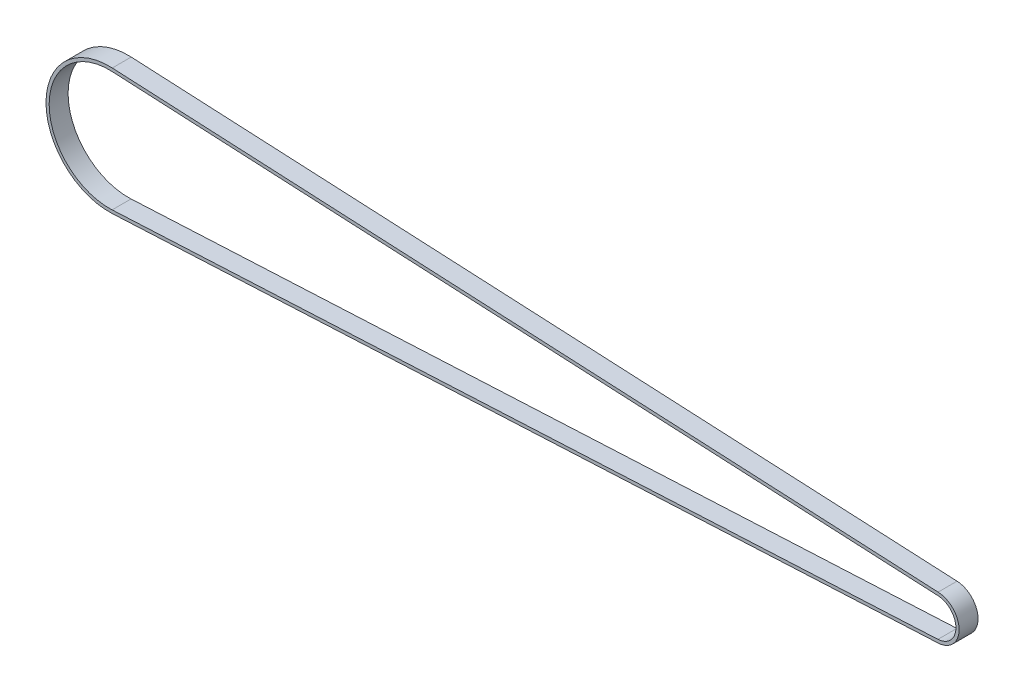
ISO-10303-21;
HEADER;
FILE_DESCRIPTION(('STEP AP214'),'2;1');
FILE_NAME('part.step','',(''),(''),'','','');
FILE_SCHEMA(('AUTOMOTIVE_DESIGN { 1 0 10303 214 1 1 1 1 }'));
ENDSEC;
DATA;
#1=APPLICATION_CONTEXT('core data for automotive mechanical design processes');
#2=APPLICATION_PROTOCOL_DEFINITION('international standard','automotive_design',2000,#1);
#3=PRODUCT_CONTEXT('',#1,'mechanical');
#4=PRODUCT('Part','Part','',(#3));
#5=PRODUCT_RELATED_PRODUCT_CATEGORY('part','',(#4));
#6=PRODUCT_DEFINITION_FORMATION('','',#4);
#7=PRODUCT_DEFINITION_CONTEXT('part definition',#1,'design');
#8=PRODUCT_DEFINITION('design','',#6,#7);
#9=PRODUCT_DEFINITION_SHAPE('','',#8);
#10=(LENGTH_UNIT() NAMED_UNIT(*) SI_UNIT(.MILLI.,.METRE.));
#11=(NAMED_UNIT(*) PLANE_ANGLE_UNIT() SI_UNIT($,.RADIAN.));
#12=(NAMED_UNIT(*) SI_UNIT($,.STERADIAN.) SOLID_ANGLE_UNIT());
#13=UNCERTAINTY_MEASURE_WITH_UNIT(LENGTH_MEASURE(1.E-05),#10,'distance_accuracy_value','');
#14=(GEOMETRIC_REPRESENTATION_CONTEXT(3) GLOBAL_UNCERTAINTY_ASSIGNED_CONTEXT((#13)) GLOBAL_UNIT_ASSIGNED_CONTEXT((#10,
#11,#12)) REPRESENTATION_CONTEXT('',''));
#15=CARTESIAN_POINT('',(0.,0.,0.));
#16=DIRECTION('',(0.,0.,1.));
#17=DIRECTION('',(1.,0.,0.));
#18=AXIS2_PLACEMENT_3D('',#15,#16,#17);
#19=CARTESIAN_POINT('',(-66.8190427074526,0.,6.));
#20=DIRECTION('',(0.,0.,1.));
#21=DIRECTION('',(1.,0.,0.));
#22=AXIS2_PLACEMENT_3D('',#19,#20,#21);
#23=PLANE('',#22);
#24=CARTESIAN_POINT('',(-66.8190427074526,0.,6.));
#25=DIRECTION('',(0.,0.,1.));
#26=DIRECTION('',(1.,0.,0.));
#27=AXIS2_PLACEMENT_3D('',#24,#25,#26);
#28=CIRCLE('',#27,20.);
#29=CARTESIAN_POINT('',(-65.8276837032224,19.975415072652,6.));
#30=VERTEX_POINT('',#29);
#31=CARTESIAN_POINT('',(-65.8276837032224,-19.975415072652,6.));
#32=VERTEX_POINT('',#31);
#33=EDGE_CURVE('E134',#30,#32,#28,.T.);
#34=ORIENTED_EDGE('',*,*,#33,.T.);
#35=DIRECTION('',(0.998770753632599,0.0495679502115076,0.));
#36=VECTOR('',#35,1.);
#37=CARTESIAN_POINT('',(-65.8276837032224,-19.975415072652,6.));
#38=LINE('',#37,#36);
#39=CARTESIAN_POINT('',(195.794174427259,-6.99139527542819,6.));
#40=VERTEX_POINT('',#39);
#41=EDGE_CURVE('E137',#32,#40,#38,.T.);
#42=ORIENTED_EDGE('',*,*,#41,.T.);
#43=CARTESIAN_POINT('',(195.447198775778,0.,6.));
#44=DIRECTION('',(0.,0.,1.));
#45=DIRECTION('',(-1.,0.,0.));
#46=AXIS2_PLACEMENT_3D('',#43,#44,#45);
#47=CIRCLE('',#46,7.);
#48=CARTESIAN_POINT('',(195.794174427259,6.99139527542819,6.));
#49=VERTEX_POINT('',#48);
#50=EDGE_CURVE('E140',#40,#49,#47,.T.);
#51=ORIENTED_EDGE('',*,*,#50,.T.);
#52=DIRECTION('',(-0.998770753632599,0.0495679502115076,0.));
#53=VECTOR('',#52,1.);
#54=CARTESIAN_POINT('',(-65.8276837032224,19.975415072652,6.));
#55=LINE('',#54,#53);
#56=EDGE_CURVE('E142',#49,#30,#55,.T.);
#57=ORIENTED_EDGE('',*,*,#56,.T.);
#58=EDGE_LOOP('',(#34,#42,#51,#57));
#59=FACE_BOUND('',#58,.T.);
#60=DIRECTION('',(0.998770753632599,0.0495679502115076,0.));
#61=VECTOR('',#60,1.);
#62=CARTESIAN_POINT('',(-65.8772516534339,-18.9766443190194,6.));
#63=LINE('',#62,#61);
#64=CARTESIAN_POINT('',(-65.8772516534339,-18.9766443190194,6.));
#65=VERTEX_POINT('',#64);
#66=CARTESIAN_POINT('',(195.744606477047,-5.9926245217956,6.));
#67=VERTEX_POINT('',#66);
#68=EDGE_CURVE('E106',#65,#67,#63,.T.);
#69=ORIENTED_EDGE('',*,*,#68,.F.);
#70=CARTESIAN_POINT('',(-66.8190427074526,0.,6.));
#71=DIRECTION('',(0.,0.,1.));
#72=DIRECTION('',(1.,0.,0.));
#73=AXIS2_PLACEMENT_3D('',#70,#71,#72);
#74=CIRCLE('',#73,19.);
#75=CARTESIAN_POINT('',(-65.8772516534339,18.9766443190194,6.));
#76=VERTEX_POINT('',#75);
#77=EDGE_CURVE('E98',#76,#65,#74,.T.);
#78=ORIENTED_EDGE('',*,*,#77,.F.);
#79=DIRECTION('',(-0.998770753632599,0.0495679502115076,0.));
#80=VECTOR('',#79,1.);
#81=CARTESIAN_POINT('',(195.744606477047,5.99262452179559,6.));
#82=LINE('',#81,#80);
#83=CARTESIAN_POINT('',(195.744606477047,5.99262452179559,6.));
#84=VERTEX_POINT('',#83);
#85=EDGE_CURVE('E120',#84,#76,#82,.T.);
#86=ORIENTED_EDGE('',*,*,#85,.F.);
#87=CARTESIAN_POINT('',(195.447198775778,0.,6.));
#88=DIRECTION('',(0.,0.,1.));
#89=DIRECTION('',(-1.,0.,0.));
#90=AXIS2_PLACEMENT_3D('',#87,#88,#89);
#91=CIRCLE('',#90,6.);
#92=EDGE_CURVE('E118',#67,#84,#91,.T.);
#93=ORIENTED_EDGE('',*,*,#92,.F.);
#94=EDGE_LOOP('',(#69,#78,#86,#93));
#95=FACE_BOUND('',#94,.T.);
#96=ADVANCED_FACE('F33',(#59,#95),#23,.T.);
#97=CARTESIAN_POINT('',(-66.8190427074526,0.,0.));
#98=DIRECTION('',(0.,0.,1.));
#99=DIRECTION('',(1.,0.,0.));
#100=AXIS2_PLACEMENT_3D('',#97,#98,#99);
#101=PLANE('',#100);
#102=CARTESIAN_POINT('',(-66.8190427074526,0.,0.));
#103=DIRECTION('',(0.,0.,1.));
#104=DIRECTION('',(1.,0.,0.));
#105=AXIS2_PLACEMENT_3D('',#102,#103,#104);
#106=CIRCLE('',#105,20.);
#107=CARTESIAN_POINT('',(-65.8276837032224,19.975415072652,0.));
#108=VERTEX_POINT('',#107);
#109=CARTESIAN_POINT('',(-65.8276837032224,-19.975415072652,0.));
#110=VERTEX_POINT('',#109);
#111=EDGE_CURVE('E114',#108,#110,#106,.T.);
#112=ORIENTED_EDGE('',*,*,#111,.F.);
#113=DIRECTION('',(-0.998770753632599,0.0495679502115076,0.));
#114=VECTOR('',#113,1.);
#115=CARTESIAN_POINT('',(-65.8276837032224,19.975415072652,0.));
#116=LINE('',#115,#114);
#117=CARTESIAN_POINT('',(195.794174427259,6.99139527542819,0.));
#118=VERTEX_POINT('',#117);
#119=EDGE_CURVE('E138',#118,#108,#116,.T.);
#120=ORIENTED_EDGE('',*,*,#119,.F.);
#121=CARTESIAN_POINT('',(195.447198775778,0.,0.));
#122=DIRECTION('',(0.,0.,1.));
#123=DIRECTION('',(-1.,0.,0.));
#124=AXIS2_PLACEMENT_3D('',#121,#122,#123);
#125=CIRCLE('',#124,7.);
#126=CARTESIAN_POINT('',(195.794174427259,-6.99139527542819,0.));
#127=VERTEX_POINT('',#126);
#128=EDGE_CURVE('E149',#127,#118,#125,.T.);
#129=ORIENTED_EDGE('',*,*,#128,.F.);
#130=DIRECTION('',(0.998770753632599,0.0495679502115076,0.));
#131=VECTOR('',#130,1.);
#132=CARTESIAN_POINT('',(-65.8276837032224,-19.975415072652,0.));
#133=LINE('',#132,#131);
#134=EDGE_CURVE('E147',#110,#127,#133,.T.);
#135=ORIENTED_EDGE('',*,*,#134,.F.);
#136=EDGE_LOOP('',(#112,#120,#129,#135));
#137=FACE_BOUND('',#136,.T.);
#138=CARTESIAN_POINT('',(-66.8190427074526,0.,0.));
#139=DIRECTION('',(0.,0.,1.));
#140=DIRECTION('',(1.,0.,0.));
#141=AXIS2_PLACEMENT_3D('',#138,#139,#140);
#142=CIRCLE('',#141,19.);
#143=CARTESIAN_POINT('',(-65.8772516534339,18.9766443190194,0.));
#144=VERTEX_POINT('',#143);
#145=CARTESIAN_POINT('',(-65.8772516534339,-18.9766443190194,0.));
#146=VERTEX_POINT('',#145);
#147=EDGE_CURVE('E56',#144,#146,#142,.T.);
#148=ORIENTED_EDGE('',*,*,#147,.T.);
#149=DIRECTION('',(0.998770753632599,0.0495679502115076,0.));
#150=VECTOR('',#149,1.);
#151=CARTESIAN_POINT('',(-65.8772516534339,-18.9766443190194,0.));
#152=LINE('',#151,#150);
#153=CARTESIAN_POINT('',(195.744606477047,-5.9926245217956,0.));
#154=VERTEX_POINT('',#153);
#155=EDGE_CURVE('E113',#146,#154,#152,.T.);
#156=ORIENTED_EDGE('',*,*,#155,.T.);
#157=CARTESIAN_POINT('',(195.447198775778,0.,0.));
#158=DIRECTION('',(0.,0.,1.));
#159=DIRECTION('',(-1.,0.,0.));
#160=AXIS2_PLACEMENT_3D('',#157,#158,#159);
#161=CIRCLE('',#160,6.);
#162=CARTESIAN_POINT('',(195.744606477047,5.99262452179559,0.));
#163=VERTEX_POINT('',#162);
#164=EDGE_CURVE('E126',#154,#163,#161,.T.);
#165=ORIENTED_EDGE('',*,*,#164,.T.);
#166=DIRECTION('',(-0.998770753632599,0.0495679502115076,0.));
#167=VECTOR('',#166,1.);
#168=CARTESIAN_POINT('',(195.744606477047,5.99262452179559,0.));
#169=LINE('',#168,#167);
#170=EDGE_CURVE('E107',#163,#144,#169,.T.);
#171=ORIENTED_EDGE('',*,*,#170,.T.);
#172=EDGE_LOOP('',(#148,#156,#165,#171));
#173=FACE_BOUND('',#172,.T.);
#174=ADVANCED_FACE('F167',(#137,#173),#101,.F.);
#175=CARTESIAN_POINT('',(-66.8190427074526,0.,6.));
#176=DIRECTION('',(0.,0.,-1.));
#177=DIRECTION('',(-1.,0.,0.));
#178=AXIS2_PLACEMENT_3D('',#175,#176,#177);
#179=CYLINDRICAL_SURFACE('',#178,20.);
#180=ORIENTED_EDGE('',*,*,#111,.T.);
#181=DIRECTION('',(0.,0.,-1.));
#182=VECTOR('',#181,1.);
#183=CARTESIAN_POINT('',(-65.8276837032224,-19.975415072652,6.));
#184=LINE('',#183,#182);
#185=EDGE_CURVE('E11',#32,#110,#184,.T.);
#186=ORIENTED_EDGE('',*,*,#185,.F.);
#187=ORIENTED_EDGE('',*,*,#33,.F.);
#188=DIRECTION('',(0.,0.,-1.));
#189=VECTOR('',#188,1.);
#190=CARTESIAN_POINT('',(-65.8276837032224,19.975415072652,6.));
#191=LINE('',#190,#189);
#192=EDGE_CURVE('E144',#30,#108,#191,.T.);
#193=ORIENTED_EDGE('',*,*,#192,.T.);
#194=EDGE_LOOP('',(#180,#186,#187,#193));
#195=FACE_BOUND('',#194,.T.);
#196=ADVANCED_FACE('F35',(#195),#179,.T.);
#197=CARTESIAN_POINT('',(-65.8276837032224,-19.975415072652,6.));
#198=DIRECTION('',(-0.0495679502115076,0.998770753632599,0.));
#199=DIRECTION('',(-0.998770753632599,-0.0495679502115076,0.));
#200=AXIS2_PLACEMENT_3D('',#197,#198,#199);
#201=PLANE('',#200);
#202=ORIENTED_EDGE('',*,*,#134,.T.);
#203=DIRECTION('',(0.,0.,-1.));
#204=VECTOR('',#203,1.);
#205=CARTESIAN_POINT('',(195.794174427259,-6.99139527542819,6.));
#206=LINE('',#205,#204);
#207=EDGE_CURVE('E41',#40,#127,#206,.T.);
#208=ORIENTED_EDGE('',*,*,#207,.F.);
#209=ORIENTED_EDGE('',*,*,#41,.F.);
#210=ORIENTED_EDGE('',*,*,#185,.T.);
#211=EDGE_LOOP('',(#202,#208,#209,#210));
#212=FACE_BOUND('',#211,.T.);
#213=ADVANCED_FACE('F177',(#212),#201,.F.);
#214=CARTESIAN_POINT('',(195.447198775778,0.,6.));
#215=DIRECTION('',(0.,0.,-1.));
#216=DIRECTION('',(-1.,0.,0.));
#217=AXIS2_PLACEMENT_3D('',#214,#215,#216);
#218=CYLINDRICAL_SURFACE('',#217,7.);
#219=ORIENTED_EDGE('',*,*,#128,.T.);
#220=DIRECTION('',(0.,0.,-1.));
#221=VECTOR('',#220,1.);
#222=CARTESIAN_POINT('',(195.794174427259,6.99139527542819,6.));
#223=LINE('',#222,#221);
#224=EDGE_CURVE('E154',#49,#118,#223,.T.);
#225=ORIENTED_EDGE('',*,*,#224,.F.);
#226=ORIENTED_EDGE('',*,*,#50,.F.);
#227=ORIENTED_EDGE('',*,*,#207,.T.);
#228=EDGE_LOOP('',(#219,#225,#226,#227));
#229=FACE_BOUND('',#228,.T.);
#230=ADVANCED_FACE('F161',(#229),#218,.T.);
#231=CARTESIAN_POINT('',(-65.8276837032224,19.975415072652,6.));
#232=DIRECTION('',(-0.0495679502115075,-0.998770753632599,0.));
#233=DIRECTION('',(0.998770753632599,-0.0495679502115075,0.));
#234=AXIS2_PLACEMENT_3D('',#231,#232,#233);
#235=PLANE('',#234);
#236=ORIENTED_EDGE('',*,*,#119,.T.);
#237=ORIENTED_EDGE('',*,*,#192,.F.);
#238=ORIENTED_EDGE('',*,*,#56,.F.);
#239=ORIENTED_EDGE('',*,*,#224,.T.);
#240=EDGE_LOOP('',(#236,#237,#238,#239));
#241=FACE_BOUND('',#240,.T.);
#242=ADVANCED_FACE('F171',(#241),#235,.F.);
#243=CARTESIAN_POINT('',(-66.8190427074526,0.,6.));
#244=DIRECTION('',(0.,0.,-1.));
#245=DIRECTION('',(-1.,0.,0.));
#246=AXIS2_PLACEMENT_3D('',#243,#244,#245);
#247=CYLINDRICAL_SURFACE('',#246,19.);
#248=ORIENTED_EDGE('',*,*,#147,.F.);
#249=DIRECTION('',(0.,0.,-1.));
#250=VECTOR('',#249,1.);
#251=CARTESIAN_POINT('',(-65.8772516534339,18.9766443190194,6.));
#252=LINE('',#251,#250);
#253=EDGE_CURVE('E102',#76,#144,#252,.T.);
#254=ORIENTED_EDGE('',*,*,#253,.F.);
#255=ORIENTED_EDGE('',*,*,#77,.T.);
#256=DIRECTION('',(0.,0.,-1.));
#257=VECTOR('',#256,1.);
#258=CARTESIAN_POINT('',(-65.8772516534339,-18.9766443190194,6.));
#259=LINE('',#258,#257);
#260=EDGE_CURVE('E101',#65,#146,#259,.T.);
#261=ORIENTED_EDGE('',*,*,#260,.T.);
#262=EDGE_LOOP('',(#248,#254,#255,#261));
#263=FACE_BOUND('',#262,.T.);
#264=ADVANCED_FACE('F100',(#263),#247,.F.);
#265=CARTESIAN_POINT('',(-65.8772516534339,-18.9766443190194,6.));
#266=DIRECTION('',(-0.0495679502115076,0.998770753632599,0.));
#267=DIRECTION('',(-0.998770753632599,-0.0495679502115076,0.));
#268=AXIS2_PLACEMENT_3D('',#265,#266,#267);
#269=PLANE('',#268);
#270=ORIENTED_EDGE('',*,*,#155,.F.);
#271=ORIENTED_EDGE('',*,*,#260,.F.);
#272=ORIENTED_EDGE('',*,*,#68,.T.);
#273=DIRECTION('',(0.,0.,-1.));
#274=VECTOR('',#273,1.);
#275=CARTESIAN_POINT('',(195.744606477047,-5.9926245217956,6.));
#276=LINE('',#275,#274);
#277=EDGE_CURVE('E115',#67,#154,#276,.T.);
#278=ORIENTED_EDGE('',*,*,#277,.T.);
#279=EDGE_LOOP('',(#270,#271,#272,#278));
#280=FACE_BOUND('',#279,.T.);
#281=ADVANCED_FACE('F110',(#280),#269,.T.);
#282=CARTESIAN_POINT('',(195.447198775778,0.,6.));
#283=DIRECTION('',(0.,0.,-1.));
#284=DIRECTION('',(-1.,0.,0.));
#285=AXIS2_PLACEMENT_3D('',#282,#283,#284);
#286=CYLINDRICAL_SURFACE('',#285,6.);
#287=ORIENTED_EDGE('',*,*,#164,.F.);
#288=ORIENTED_EDGE('',*,*,#277,.F.);
#289=ORIENTED_EDGE('',*,*,#92,.T.);
#290=DIRECTION('',(0.,0.,-1.));
#291=VECTOR('',#290,1.);
#292=CARTESIAN_POINT('',(195.744606477047,5.99262452179559,6.));
#293=LINE('',#292,#291);
#294=EDGE_CURVE('E48',#84,#163,#293,.T.);
#295=ORIENTED_EDGE('',*,*,#294,.T.);
#296=EDGE_LOOP('',(#287,#288,#289,#295));
#297=FACE_BOUND('',#296,.T.);
#298=ADVANCED_FACE('F200',(#297),#286,.F.);
#299=CARTESIAN_POINT('',(195.744606477047,5.99262452179559,6.));
#300=DIRECTION('',(-0.0495679502115076,-0.998770753632599,0.));
#301=DIRECTION('',(0.998770753632599,-0.0495679502115076,0.));
#302=AXIS2_PLACEMENT_3D('',#299,#300,#301);
#303=PLANE('',#302);
#304=ORIENTED_EDGE('',*,*,#170,.F.);
#305=ORIENTED_EDGE('',*,*,#294,.F.);
#306=ORIENTED_EDGE('',*,*,#85,.T.);
#307=ORIENTED_EDGE('',*,*,#253,.T.);
#308=EDGE_LOOP('',(#304,#305,#306,#307));
#309=FACE_BOUND('',#308,.T.);
#310=ADVANCED_FACE('F204',(#309),#303,.T.);
#311=CLOSED_SHELL('',(#96,#174,#196,#213,#230,#242,#264,#281,#298,#310));
#312=MANIFOLD_SOLID_BREP('B2',#311);
#313=ADVANCED_BREP_SHAPE_REPRESENTATION('',(#18,#312),#14);
#314=SHAPE_DEFINITION_REPRESENTATION(#9,#313);
ENDSEC;
END-ISO-10303-21;
